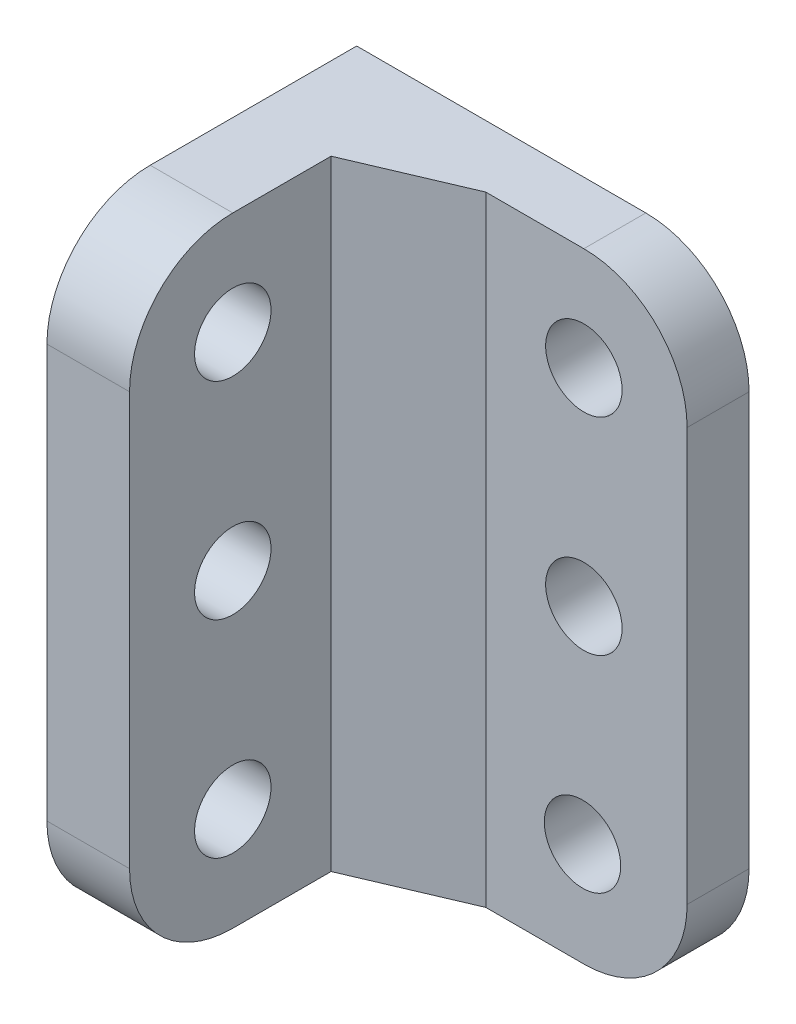
ISO-10303-21;
HEADER;
FILE_DESCRIPTION(('STEP AP214'),'2;1');
FILE_NAME('part.step','',(''),(''),'','','');
FILE_SCHEMA(('AUTOMOTIVE_DESIGN { 1 0 10303 214 1 1 1 1 }'));
ENDSEC;
DATA;
#1=APPLICATION_CONTEXT('core data for automotive mechanical design processes');
#2=APPLICATION_PROTOCOL_DEFINITION('international standard','automotive_design',2000,#1);
#3=PRODUCT_CONTEXT('',#1,'mechanical');
#4=PRODUCT('Part','Part','',(#3));
#5=PRODUCT_RELATED_PRODUCT_CATEGORY('part','',(#4));
#6=PRODUCT_DEFINITION_FORMATION('','',#4);
#7=PRODUCT_DEFINITION_CONTEXT('part definition',#1,'design');
#8=PRODUCT_DEFINITION('design','',#6,#7);
#9=PRODUCT_DEFINITION_SHAPE('','',#8);
#10=(LENGTH_UNIT() NAMED_UNIT(*) SI_UNIT(.MILLI.,.METRE.));
#11=(NAMED_UNIT(*) PLANE_ANGLE_UNIT() SI_UNIT($,.RADIAN.));
#12=(NAMED_UNIT(*) SI_UNIT($,.STERADIAN.) SOLID_ANGLE_UNIT());
#13=UNCERTAINTY_MEASURE_WITH_UNIT(LENGTH_MEASURE(1.E-05),#10,'distance_accuracy_value','');
#14=(GEOMETRIC_REPRESENTATION_CONTEXT(3) GLOBAL_UNCERTAINTY_ASSIGNED_CONTEXT((#13)) GLOBAL_UNIT_ASSIGNED_CONTEXT((#10,
#11,#12)) REPRESENTATION_CONTEXT('',''));
#15=CARTESIAN_POINT('',(0.,0.,0.));
#16=DIRECTION('',(0.,0.,1.));
#17=DIRECTION('',(1.,0.,0.));
#18=AXIS2_PLACEMENT_3D('',#15,#16,#17);
#19=CARTESIAN_POINT('',(0.,38.1,19.05));
#20=DIRECTION('',(1.,0.,0.));
#21=DIRECTION('',(0.,0.,-1.));
#22=AXIS2_PLACEMENT_3D('',#19,#20,#21);
#23=PLANE('',#22);
#24=CARTESIAN_POINT('',(0.,31.75,12.7));
#25=DIRECTION('',(1.,0.,0.));
#26=DIRECTION('',(0.,0.,-1.));
#27=AXIS2_PLACEMENT_3D('',#24,#25,#26);
#28=CIRCLE('',#27,2.3495);
#29=CARTESIAN_POINT('',(0.,31.75,10.3505));
#30=VERTEX_POINT('',#29);
#31=EDGE_CURVE('E296',#30,#30,#28,.T.);
#32=ORIENTED_EDGE('',*,*,#31,.T.);
#33=EDGE_LOOP('',(#32));
#34=FACE_BOUND('',#33,.T.);
#35=CARTESIAN_POINT('',(0.,19.05,12.7));
#36=DIRECTION('',(1.,0.,0.));
#37=DIRECTION('',(0.,0.,-1.));
#38=AXIS2_PLACEMENT_3D('',#35,#36,#37);
#39=CIRCLE('',#38,2.3495);
#40=CARTESIAN_POINT('',(0.,19.05,10.3505));
#41=VERTEX_POINT('',#40);
#42=EDGE_CURVE('E300',#41,#41,#39,.T.);
#43=ORIENTED_EDGE('',*,*,#42,.T.);
#44=EDGE_LOOP('',(#43));
#45=FACE_BOUND('',#44,.T.);
#46=CARTESIAN_POINT('',(0.,6.35000000000001,12.7));
#47=DIRECTION('',(1.,0.,0.));
#48=DIRECTION('',(0.,0.,-1.));
#49=AXIS2_PLACEMENT_3D('',#46,#47,#48);
#50=CIRCLE('',#49,2.3495);
#51=CARTESIAN_POINT('',(0.,6.35000000000001,10.3505));
#52=VERTEX_POINT('',#51);
#53=EDGE_CURVE('E310',#52,#52,#50,.T.);
#54=ORIENTED_EDGE('',*,*,#53,.T.);
#55=EDGE_LOOP('',(#54));
#56=FACE_BOUND('',#55,.T.);
#57=DIRECTION('',(0.,0.,1.));
#58=VECTOR('',#57,1.);
#59=CARTESIAN_POINT('',(0.,0.,19.05));
#60=LINE('',#59,#58);
#61=CARTESIAN_POINT('',(0.,0.,0.));
#62=VERTEX_POINT('',#61);
#63=CARTESIAN_POINT('',(0.,0.,12.7));
#64=VERTEX_POINT('',#63);
#65=EDGE_CURVE('E151',#62,#64,#60,.T.);
#66=ORIENTED_EDGE('',*,*,#65,.T.);
#67=CARTESIAN_POINT('',(0.,6.35,12.7));
#68=DIRECTION('',(1.,0.,0.));
#69=DIRECTION('',(0.,0.,-1.));
#70=AXIS2_PLACEMENT_3D('',#67,#68,#69);
#71=CIRCLE('',#70,6.35);
#72=CARTESIAN_POINT('',(0.,6.35000000000002,19.05));
#73=VERTEX_POINT('',#72);
#74=EDGE_CURVE('E11',#64,#73,#71,.F.);
#75=ORIENTED_EDGE('',*,*,#74,.T.);
#76=DIRECTION('',(0.,-1.,0.));
#77=VECTOR('',#76,1.);
#78=CARTESIAN_POINT('',(0.,38.1,19.05));
#79=LINE('',#78,#77);
#80=CARTESIAN_POINT('',(0.,31.75,19.05));
#81=VERTEX_POINT('',#80);
#82=EDGE_CURVE('E172',#81,#73,#79,.T.);
#83=ORIENTED_EDGE('',*,*,#82,.F.);
#84=CARTESIAN_POINT('',(0.,31.75,12.7));
#85=DIRECTION('',(1.,0.,0.));
#86=DIRECTION('',(0.,0.,-1.));
#87=AXIS2_PLACEMENT_3D('',#84,#85,#86);
#88=CIRCLE('',#87,6.35);
#89=CARTESIAN_POINT('',(0.,38.1,12.7));
#90=VERTEX_POINT('',#89);
#91=EDGE_CURVE('E41',#81,#90,#88,.F.);
#92=ORIENTED_EDGE('',*,*,#91,.T.);
#93=DIRECTION('',(0.,0.,1.));
#94=VECTOR('',#93,1.);
#95=CARTESIAN_POINT('',(0.,38.1,19.05));
#96=LINE('',#95,#94);
#97=CARTESIAN_POINT('',(0.,38.1,0.));
#98=VERTEX_POINT('',#97);
#99=EDGE_CURVE('E127',#98,#90,#96,.T.);
#100=ORIENTED_EDGE('',*,*,#99,.F.);
#101=DIRECTION('',(0.,-1.,0.));
#102=VECTOR('',#101,1.);
#103=CARTESIAN_POINT('',(0.,38.1,0.));
#104=LINE('',#103,#102);
#105=EDGE_CURVE('E150',#98,#62,#104,.T.);
#106=ORIENTED_EDGE('',*,*,#105,.T.);
#107=EDGE_LOOP('',(#66,#75,#83,#92,#100,#106));
#108=FACE_BOUND('',#107,.T.);
#109=ADVANCED_FACE('F33',(#34,#45,#56,#108),#23,.F.);
#110=CARTESIAN_POINT('',(5.08,38.1,19.05));
#111=DIRECTION('',(0.,0.,-1.));
#112=DIRECTION('',(-1.,0.,0.));
#113=AXIS2_PLACEMENT_3D('',#110,#111,#112);
#114=PLANE('',#113);
#115=ORIENTED_EDGE('',*,*,#82,.T.);
#116=DIRECTION('',(1.,0.,0.));
#117=VECTOR('',#116,1.);
#118=CARTESIAN_POINT('',(5.08,6.35,19.05));
#119=LINE('',#118,#117);
#120=CARTESIAN_POINT('',(5.08,6.35000000000002,19.05));
#121=VERTEX_POINT('',#120);
#122=EDGE_CURVE('E196',#73,#121,#119,.T.);
#123=ORIENTED_EDGE('',*,*,#122,.T.);
#124=DIRECTION('',(0.,-1.,0.));
#125=VECTOR('',#124,1.);
#126=CARTESIAN_POINT('',(5.08,38.1,19.05));
#127=LINE('',#126,#125);
#128=CARTESIAN_POINT('',(5.08,31.75,19.05));
#129=VERTEX_POINT('',#128);
#130=EDGE_CURVE('E137',#129,#121,#127,.T.);
#131=ORIENTED_EDGE('',*,*,#130,.F.);
#132=DIRECTION('',(1.,0.,0.));
#133=VECTOR('',#132,1.);
#134=CARTESIAN_POINT('',(5.08,31.75,19.05));
#135=LINE('',#134,#133);
#136=EDGE_CURVE('E53',#129,#81,#135,.F.);
#137=ORIENTED_EDGE('',*,*,#136,.T.);
#138=EDGE_LOOP('',(#115,#123,#131,#137));
#139=FACE_BOUND('',#138,.T.);
#140=ADVANCED_FACE('F207',(#139),#114,.F.);
#141=CARTESIAN_POINT('',(5.08,38.1,6.6548));
#142=DIRECTION('',(-1.,0.,0.));
#143=DIRECTION('',(0.,0.,1.));
#144=AXIS2_PLACEMENT_3D('',#141,#142,#143);
#145=PLANE('',#144);
#146=CARTESIAN_POINT('',(5.08,31.75,12.7));
#147=DIRECTION('',(1.,0.,0.));
#148=DIRECTION('',(0.,0.,-1.));
#149=AXIS2_PLACEMENT_3D('',#146,#147,#148);
#150=CIRCLE('',#149,2.3495);
#151=CARTESIAN_POINT('',(5.08,31.75,10.3505));
#152=VERTEX_POINT('',#151);
#153=EDGE_CURVE('E299',#152,#152,#150,.T.);
#154=ORIENTED_EDGE('',*,*,#153,.F.);
#155=EDGE_LOOP('',(#154));
#156=FACE_BOUND('',#155,.T.);
#157=CARTESIAN_POINT('',(5.08,19.05,12.7));
#158=DIRECTION('',(1.,0.,0.));
#159=DIRECTION('',(0.,0.,-1.));
#160=AXIS2_PLACEMENT_3D('',#157,#158,#159);
#161=CIRCLE('',#160,2.3495);
#162=CARTESIAN_POINT('',(5.08,19.05,10.3505));
#163=VERTEX_POINT('',#162);
#164=EDGE_CURVE('E305',#163,#163,#161,.T.);
#165=ORIENTED_EDGE('',*,*,#164,.F.);
#166=EDGE_LOOP('',(#165));
#167=FACE_BOUND('',#166,.T.);
#168=CARTESIAN_POINT('',(5.08,6.35000000000001,12.7));
#169=DIRECTION('',(1.,0.,0.));
#170=DIRECTION('',(0.,0.,-1.));
#171=AXIS2_PLACEMENT_3D('',#168,#169,#170);
#172=CIRCLE('',#171,2.3495);
#173=CARTESIAN_POINT('',(5.08,6.35000000000001,10.3505));
#174=VERTEX_POINT('',#173);
#175=EDGE_CURVE('E313',#174,#174,#172,.T.);
#176=ORIENTED_EDGE('',*,*,#175,.F.);
#177=EDGE_LOOP('',(#176));
#178=FACE_BOUND('',#177,.T.);
#179=ORIENTED_EDGE('',*,*,#130,.T.);
#180=CARTESIAN_POINT('',(5.08,6.35,12.7));
#181=DIRECTION('',(-1.,0.,0.));
#182=DIRECTION('',(0.,0.,1.));
#183=AXIS2_PLACEMENT_3D('',#180,#181,#182);
#184=CIRCLE('',#183,6.35);
#185=CARTESIAN_POINT('',(5.08,0.,12.7));
#186=VERTEX_POINT('',#185);
#187=EDGE_CURVE('E201',#121,#186,#184,.F.);
#188=ORIENTED_EDGE('',*,*,#187,.T.);
#189=DIRECTION('',(0.,0.,-1.));
#190=VECTOR('',#189,1.);
#191=CARTESIAN_POINT('',(5.08,0.,6.6548));
#192=LINE('',#191,#190);
#193=CARTESIAN_POINT('',(5.08,0.,6.6548));
#194=VERTEX_POINT('',#193);
#195=EDGE_CURVE('E134',#186,#194,#192,.T.);
#196=ORIENTED_EDGE('',*,*,#195,.T.);
#197=DIRECTION('',(0.,-1.,0.));
#198=VECTOR('',#197,1.);
#199=CARTESIAN_POINT('',(5.08,38.1,6.6548));
#200=LINE('',#199,#198);
#201=CARTESIAN_POINT('',(5.08,38.1,6.6548));
#202=VERTEX_POINT('',#201);
#203=EDGE_CURVE('E130',#202,#194,#200,.T.);
#204=ORIENTED_EDGE('',*,*,#203,.F.);
#205=DIRECTION('',(0.,0.,-1.));
#206=VECTOR('',#205,1.);
#207=CARTESIAN_POINT('',(5.08,38.1,6.6548));
#208=LINE('',#207,#206);
#209=CARTESIAN_POINT('',(5.08,38.1,12.7));
#210=VERTEX_POINT('',#209);
#211=EDGE_CURVE('E116',#210,#202,#208,.T.);
#212=ORIENTED_EDGE('',*,*,#211,.F.);
#213=CARTESIAN_POINT('',(5.08,31.75,12.7));
#214=DIRECTION('',(-1.,0.,0.));
#215=DIRECTION('',(0.,0.,1.));
#216=AXIS2_PLACEMENT_3D('',#213,#214,#215);
#217=CIRCLE('',#216,6.35);
#218=EDGE_CURVE('E199',#210,#129,#217,.F.);
#219=ORIENTED_EDGE('',*,*,#218,.T.);
#220=EDGE_LOOP('',(#179,#188,#196,#204,#212,#219));
#221=FACE_BOUND('',#220,.T.);
#222=ADVANCED_FACE('F132',(#156,#167,#178,#221),#145,.F.);
#223=CARTESIAN_POINT('',(11.7475,38.1,3.81));
#224=DIRECTION('',(-0.392438685047784,0.,-0.919778168080742));
#225=DIRECTION('',(-0.919778168080743,0.,0.392438685047784));
#226=AXIS2_PLACEMENT_3D('',#223,#224,#225);
#227=PLANE('',#226);
#228=DIRECTION('',(0.919778168080743,0.,-0.392438685047784));
#229=VECTOR('',#228,1.);
#230=CARTESIAN_POINT('',(11.7475,0.,3.81));
#231=LINE('',#230,#229);
#232=CARTESIAN_POINT('',(11.7475,0.,3.81));
#233=VERTEX_POINT('',#232);
#234=EDGE_CURVE('E155',#194,#233,#231,.T.);
#235=ORIENTED_EDGE('',*,*,#234,.T.);
#236=DIRECTION('',(0.,-1.,0.));
#237=VECTOR('',#236,1.);
#238=CARTESIAN_POINT('',(11.7475,38.1,3.81));
#239=LINE('',#238,#237);
#240=CARTESIAN_POINT('',(11.7475,38.1,3.81));
#241=VERTEX_POINT('',#240);
#242=EDGE_CURVE('E138',#241,#233,#239,.T.);
#243=ORIENTED_EDGE('',*,*,#242,.F.);
#244=DIRECTION('',(0.919778168080743,0.,-0.392438685047784));
#245=VECTOR('',#244,1.);
#246=CARTESIAN_POINT('',(11.7475,38.1,3.81));
#247=LINE('',#246,#245);
#248=EDGE_CURVE('E121',#202,#241,#247,.T.);
#249=ORIENTED_EDGE('',*,*,#248,.F.);
#250=ORIENTED_EDGE('',*,*,#203,.T.);
#251=EDGE_LOOP('',(#235,#243,#249,#250));
#252=FACE_BOUND('',#251,.T.);
#253=ADVANCED_FACE('F140',(#252),#227,.F.);
#254=CARTESIAN_POINT('',(24.13,38.1,3.81));
#255=DIRECTION('',(0.,0.,-1.));
#256=DIRECTION('',(-1.,0.,0.));
#257=AXIS2_PLACEMENT_3D('',#254,#255,#256);
#258=PLANE('',#257);
#259=CARTESIAN_POINT('',(17.6973232323232,6.35000000000001,3.81));
#260=DIRECTION('',(0.,0.,1.));
#261=DIRECTION('',(1.,0.,0.));
#262=AXIS2_PLACEMENT_3D('',#259,#260,#261);
#263=CIRCLE('',#262,2.3495);
#264=CARTESIAN_POINT('',(20.0468232323232,6.35000000000001,3.81));
#265=VERTEX_POINT('',#264);
#266=EDGE_CURVE('E318',#265,#265,#263,.T.);
#267=ORIENTED_EDGE('',*,*,#266,.F.);
#268=EDGE_LOOP('',(#267));
#269=FACE_BOUND('',#268,.T.);
#270=CARTESIAN_POINT('',(17.78,19.05,3.81));
#271=DIRECTION('',(0.,0.,1.));
#272=DIRECTION('',(1.,0.,0.));
#273=AXIS2_PLACEMENT_3D('',#270,#271,#272);
#274=CIRCLE('',#273,2.3495);
#275=CARTESIAN_POINT('',(20.1295,19.05,3.81));
#276=VERTEX_POINT('',#275);
#277=EDGE_CURVE('E324',#276,#276,#274,.T.);
#278=ORIENTED_EDGE('',*,*,#277,.F.);
#279=EDGE_LOOP('',(#278));
#280=FACE_BOUND('',#279,.T.);
#281=CARTESIAN_POINT('',(17.78,31.75,3.81));
#282=DIRECTION('',(0.,0.,1.));
#283=DIRECTION('',(1.,0.,0.));
#284=AXIS2_PLACEMENT_3D('',#281,#282,#283);
#285=CIRCLE('',#284,2.3495);
#286=CARTESIAN_POINT('',(20.1295,31.75,3.81));
#287=VERTEX_POINT('',#286);
#288=EDGE_CURVE('E302',#287,#287,#285,.T.);
#289=ORIENTED_EDGE('',*,*,#288,.F.);
#290=EDGE_LOOP('',(#289));
#291=FACE_BOUND('',#290,.T.);
#292=DIRECTION('',(0.,-1.,0.));
#293=VECTOR('',#292,1.);
#294=CARTESIAN_POINT('',(24.13,38.1,3.81));
#295=LINE('',#294,#293);
#296=CARTESIAN_POINT('',(24.13,31.75,3.81));
#297=VERTEX_POINT('',#296);
#298=CARTESIAN_POINT('',(24.13,6.35000000000002,3.81));
#299=VERTEX_POINT('',#298);
#300=EDGE_CURVE('E167',#297,#299,#295,.T.);
#301=ORIENTED_EDGE('',*,*,#300,.F.);
#302=CARTESIAN_POINT('',(17.78,31.75,3.81));
#303=DIRECTION('',(0.,0.,-1.));
#304=DIRECTION('',(-1.,0.,0.));
#305=AXIS2_PLACEMENT_3D('',#302,#303,#304);
#306=CIRCLE('',#305,6.35);
#307=CARTESIAN_POINT('',(17.78,38.1,3.81));
#308=VERTEX_POINT('',#307);
#309=EDGE_CURVE('E189',#297,#308,#306,.F.);
#310=ORIENTED_EDGE('',*,*,#309,.T.);
#311=DIRECTION('',(1.,0.,0.));
#312=VECTOR('',#311,1.);
#313=CARTESIAN_POINT('',(24.13,38.1,3.81));
#314=LINE('',#313,#312);
#315=EDGE_CURVE('E143',#241,#308,#314,.T.);
#316=ORIENTED_EDGE('',*,*,#315,.F.);
#317=ORIENTED_EDGE('',*,*,#242,.T.);
#318=DIRECTION('',(1.,0.,0.));
#319=VECTOR('',#318,1.);
#320=CARTESIAN_POINT('',(24.13,0.,3.81));
#321=LINE('',#320,#319);
#322=CARTESIAN_POINT('',(17.78,0.,3.81));
#323=VERTEX_POINT('',#322);
#324=EDGE_CURVE('E157',#233,#323,#321,.T.);
#325=ORIENTED_EDGE('',*,*,#324,.T.);
#326=CARTESIAN_POINT('',(17.78,6.35,3.81));
#327=DIRECTION('',(0.,0.,-1.));
#328=DIRECTION('',(-1.,0.,0.));
#329=AXIS2_PLACEMENT_3D('',#326,#327,#328);
#330=CIRCLE('',#329,6.35);
#331=EDGE_CURVE('E187',#323,#299,#330,.F.);
#332=ORIENTED_EDGE('',*,*,#331,.T.);
#333=EDGE_LOOP('',(#301,#310,#316,#317,#325,#332));
#334=FACE_BOUND('',#333,.T.);
#335=ADVANCED_FACE('F219',(#269,#280,#291,#334),#258,.F.);
#336=CARTESIAN_POINT('',(24.13,38.1,0.));
#337=DIRECTION('',(-1.,0.,0.));
#338=DIRECTION('',(0.,0.,1.));
#339=AXIS2_PLACEMENT_3D('',#336,#337,#338);
#340=PLANE('',#339);
#341=DIRECTION('',(0.,-1.,0.));
#342=VECTOR('',#341,1.);
#343=CARTESIAN_POINT('',(24.13,38.1,0.));
#344=LINE('',#343,#342);
#345=CARTESIAN_POINT('',(24.13,31.75,0.));
#346=VERTEX_POINT('',#345);
#347=CARTESIAN_POINT('',(24.13,6.35000000000002,0.));
#348=VERTEX_POINT('',#347);
#349=EDGE_CURVE('E164',#346,#348,#344,.T.);
#350=ORIENTED_EDGE('',*,*,#349,.F.);
#351=DIRECTION('',(0.,0.,-1.));
#352=VECTOR('',#351,1.);
#353=CARTESIAN_POINT('',(24.13,31.75,0.));
#354=LINE('',#353,#352);
#355=EDGE_CURVE('E185',#346,#297,#354,.F.);
#356=ORIENTED_EDGE('',*,*,#355,.T.);
#357=ORIENTED_EDGE('',*,*,#300,.T.);
#358=DIRECTION('',(0.,0.,-1.));
#359=VECTOR('',#358,1.);
#360=CARTESIAN_POINT('',(24.13,6.35,0.));
#361=LINE('',#360,#359);
#362=EDGE_CURVE('E182',#299,#348,#361,.T.);
#363=ORIENTED_EDGE('',*,*,#362,.T.);
#364=EDGE_LOOP('',(#350,#356,#357,#363));
#365=FACE_BOUND('',#364,.T.);
#366=ADVANCED_FACE('F230',(#365),#340,.F.);
#367=CARTESIAN_POINT('',(0.,38.1,0.));
#368=DIRECTION('',(0.,0.,1.));
#369=DIRECTION('',(1.,0.,0.));
#370=AXIS2_PLACEMENT_3D('',#367,#368,#369);
#371=PLANE('',#370);
#372=CARTESIAN_POINT('',(17.6973232323232,6.35000000000001,0.));
#373=DIRECTION('',(0.,0.,1.));
#374=DIRECTION('',(1.,0.,0.));
#375=AXIS2_PLACEMENT_3D('',#372,#373,#374);
#376=CIRCLE('',#375,2.3495);
#377=CARTESIAN_POINT('',(20.0468232323232,6.35000000000001,0.));
#378=VERTEX_POINT('',#377);
#379=EDGE_CURVE('E153',#378,#378,#376,.T.);
#380=ORIENTED_EDGE('',*,*,#379,.T.);
#381=EDGE_LOOP('',(#380));
#382=FACE_BOUND('',#381,.T.);
#383=CARTESIAN_POINT('',(17.78,19.05,0.));
#384=DIRECTION('',(0.,0.,1.));
#385=DIRECTION('',(1.,0.,0.));
#386=AXIS2_PLACEMENT_3D('',#383,#384,#385);
#387=CIRCLE('',#386,2.3495);
#388=CARTESIAN_POINT('',(20.1295,19.05,0.));
#389=VERTEX_POINT('',#388);
#390=EDGE_CURVE('E321',#389,#389,#387,.T.);
#391=ORIENTED_EDGE('',*,*,#390,.T.);
#392=EDGE_LOOP('',(#391));
#393=FACE_BOUND('',#392,.T.);
#394=CARTESIAN_POINT('',(17.78,31.75,0.));
#395=DIRECTION('',(0.,0.,1.));
#396=DIRECTION('',(1.,0.,0.));
#397=AXIS2_PLACEMENT_3D('',#394,#395,#396);
#398=CIRCLE('',#397,2.3495);
#399=CARTESIAN_POINT('',(20.1295,31.75,0.));
#400=VERTEX_POINT('',#399);
#401=EDGE_CURVE('E327',#400,#400,#398,.T.);
#402=ORIENTED_EDGE('',*,*,#401,.T.);
#403=EDGE_LOOP('',(#402));
#404=FACE_BOUND('',#403,.T.);
#405=DIRECTION('',(-1.,0.,0.));
#406=VECTOR('',#405,1.);
#407=CARTESIAN_POINT('',(0.,38.1,0.));
#408=LINE('',#407,#406);
#409=CARTESIAN_POINT('',(17.78,38.1,0.));
#410=VERTEX_POINT('',#409);
#411=EDGE_CURVE('E145',#410,#98,#408,.T.);
#412=ORIENTED_EDGE('',*,*,#411,.F.);
#413=CARTESIAN_POINT('',(17.78,31.75,0.));
#414=DIRECTION('',(0.,0.,1.));
#415=DIRECTION('',(1.,0.,0.));
#416=AXIS2_PLACEMENT_3D('',#413,#414,#415);
#417=CIRCLE('',#416,6.35);
#418=EDGE_CURVE('E180',#410,#346,#417,.F.);
#419=ORIENTED_EDGE('',*,*,#418,.T.);
#420=ORIENTED_EDGE('',*,*,#349,.T.);
#421=CARTESIAN_POINT('',(17.78,6.35,0.));
#422=DIRECTION('',(0.,0.,1.));
#423=DIRECTION('',(1.,0.,0.));
#424=AXIS2_PLACEMENT_3D('',#421,#422,#423);
#425=CIRCLE('',#424,6.35);
#426=CARTESIAN_POINT('',(17.78,0.,0.));
#427=VERTEX_POINT('',#426);
#428=EDGE_CURVE('E178',#348,#427,#425,.F.);
#429=ORIENTED_EDGE('',*,*,#428,.T.);
#430=DIRECTION('',(-1.,0.,0.));
#431=VECTOR('',#430,1.);
#432=CARTESIAN_POINT('',(0.,0.,0.));
#433=LINE('',#432,#431);
#434=EDGE_CURVE('E160',#427,#62,#433,.T.);
#435=ORIENTED_EDGE('',*,*,#434,.T.);
#436=ORIENTED_EDGE('',*,*,#105,.F.);
#437=EDGE_LOOP('',(#412,#419,#420,#429,#435,#436));
#438=FACE_BOUND('',#437,.T.);
#439=ADVANCED_FACE('F228',(#382,#393,#404,#438),#371,.F.);
#440=CARTESIAN_POINT('',(0.,38.1,0.));
#441=DIRECTION('',(0.,-1.,0.));
#442=DIRECTION('',(0.,0.,-1.));
#443=AXIS2_PLACEMENT_3D('',#440,#441,#442);
#444=PLANE('',#443);
#445=ORIENTED_EDGE('',*,*,#315,.T.);
#446=DIRECTION('',(0.,0.,-1.));
#447=VECTOR('',#446,1.);
#448=CARTESIAN_POINT('',(17.78,38.1,0.));
#449=LINE('',#448,#447);
#450=EDGE_CURVE('E175',#308,#410,#449,.T.);
#451=ORIENTED_EDGE('',*,*,#450,.T.);
#452=ORIENTED_EDGE('',*,*,#411,.T.);
#453=ORIENTED_EDGE('',*,*,#99,.T.);
#454=DIRECTION('',(1.,0.,0.));
#455=VECTOR('',#454,1.);
#456=CARTESIAN_POINT('',(0.,38.1,12.7));
#457=LINE('',#456,#455);
#458=EDGE_CURVE('E125',#90,#210,#457,.T.);
#459=ORIENTED_EDGE('',*,*,#458,.T.);
#460=ORIENTED_EDGE('',*,*,#211,.T.);
#461=ORIENTED_EDGE('',*,*,#248,.T.);
#462=EDGE_LOOP('',(#445,#451,#452,#453,#459,#460,#461));
#463=FACE_BOUND('',#462,.T.);
#464=ADVANCED_FACE('F119',(#463),#444,.F.);
#465=CARTESIAN_POINT('',(0.,0.,0.));
#466=DIRECTION('',(0.,-1.,0.));
#467=DIRECTION('',(0.,0.,-1.));
#468=AXIS2_PLACEMENT_3D('',#465,#466,#467);
#469=PLANE('',#468);
#470=ORIENTED_EDGE('',*,*,#434,.F.);
#471=DIRECTION('',(0.,0.,-1.));
#472=VECTOR('',#471,1.);
#473=CARTESIAN_POINT('',(17.78,0.,3.81));
#474=LINE('',#473,#472);
#475=EDGE_CURVE('E193',#427,#323,#474,.F.);
#476=ORIENTED_EDGE('',*,*,#475,.T.);
#477=ORIENTED_EDGE('',*,*,#324,.F.);
#478=ORIENTED_EDGE('',*,*,#234,.F.);
#479=ORIENTED_EDGE('',*,*,#195,.F.);
#480=DIRECTION('',(1.,0.,0.));
#481=VECTOR('',#480,1.);
#482=CARTESIAN_POINT('',(0.,0.,12.7));
#483=LINE('',#482,#481);
#484=EDGE_CURVE('E191',#186,#64,#483,.F.);
#485=ORIENTED_EDGE('',*,*,#484,.T.);
#486=ORIENTED_EDGE('',*,*,#65,.F.);
#487=EDGE_LOOP('',(#470,#476,#477,#478,#479,#485,#486));
#488=FACE_BOUND('',#487,.T.);
#489=ADVANCED_FACE('F214',(#488),#469,.T.);
#490=CARTESIAN_POINT('',(17.78,31.75,0.));
#491=DIRECTION('',(0.,0.,1.));
#492=DIRECTION('',(1.,0.,0.));
#493=AXIS2_PLACEMENT_3D('',#490,#491,#492);
#494=CYLINDRICAL_SURFACE('',#493,2.3495);
#495=ORIENTED_EDGE('',*,*,#401,.F.);
#496=EDGE_LOOP('',(#495));
#497=FACE_BOUND('',#496,.T.);
#498=ORIENTED_EDGE('',*,*,#288,.T.);
#499=EDGE_LOOP('',(#498));
#500=FACE_BOUND('',#499,.T.);
#501=ADVANCED_FACE('F268',(#497,#500),#494,.F.);
#502=CARTESIAN_POINT('',(17.78,19.05,0.));
#503=DIRECTION('',(0.,0.,1.));
#504=DIRECTION('',(1.,0.,0.));
#505=AXIS2_PLACEMENT_3D('',#502,#503,#504);
#506=CYLINDRICAL_SURFACE('',#505,2.3495);
#507=ORIENTED_EDGE('',*,*,#390,.F.);
#508=EDGE_LOOP('',(#507));
#509=FACE_BOUND('',#508,.T.);
#510=ORIENTED_EDGE('',*,*,#277,.T.);
#511=EDGE_LOOP('',(#510));
#512=FACE_BOUND('',#511,.T.);
#513=ADVANCED_FACE('F273',(#509,#512),#506,.F.);
#514=CARTESIAN_POINT('',(17.6973232323232,6.35000000000001,0.));
#515=DIRECTION('',(0.,0.,1.));
#516=DIRECTION('',(1.,0.,0.));
#517=AXIS2_PLACEMENT_3D('',#514,#515,#516);
#518=CYLINDRICAL_SURFACE('',#517,2.3495);
#519=ORIENTED_EDGE('',*,*,#379,.F.);
#520=EDGE_LOOP('',(#519));
#521=FACE_BOUND('',#520,.T.);
#522=ORIENTED_EDGE('',*,*,#266,.T.);
#523=EDGE_LOOP('',(#522));
#524=FACE_BOUND('',#523,.T.);
#525=ADVANCED_FACE('F277',(#521,#524),#518,.F.);
#526=CARTESIAN_POINT('',(0.,6.35000000000001,12.7));
#527=DIRECTION('',(1.,0.,0.));
#528=DIRECTION('',(0.,0.,-1.));
#529=AXIS2_PLACEMENT_3D('',#526,#527,#528);
#530=CYLINDRICAL_SURFACE('',#529,2.3495);
#531=ORIENTED_EDGE('',*,*,#53,.F.);
#532=EDGE_LOOP('',(#531));
#533=FACE_BOUND('',#532,.T.);
#534=ORIENTED_EDGE('',*,*,#175,.T.);
#535=EDGE_LOOP('',(#534));
#536=FACE_BOUND('',#535,.T.);
#537=ADVANCED_FACE('F281',(#533,#536),#530,.F.);
#538=CARTESIAN_POINT('',(0.,19.05,12.7));
#539=DIRECTION('',(1.,0.,0.));
#540=DIRECTION('',(0.,0.,-1.));
#541=AXIS2_PLACEMENT_3D('',#538,#539,#540);
#542=CYLINDRICAL_SURFACE('',#541,2.3495);
#543=ORIENTED_EDGE('',*,*,#42,.F.);
#544=EDGE_LOOP('',(#543));
#545=FACE_BOUND('',#544,.T.);
#546=ORIENTED_EDGE('',*,*,#164,.T.);
#547=EDGE_LOOP('',(#546));
#548=FACE_BOUND('',#547,.T.);
#549=ADVANCED_FACE('F285',(#545,#548),#542,.F.);
#550=CARTESIAN_POINT('',(0.,31.75,12.7));
#551=DIRECTION('',(1.,0.,0.));
#552=DIRECTION('',(0.,0.,-1.));
#553=AXIS2_PLACEMENT_3D('',#550,#551,#552);
#554=CYLINDRICAL_SURFACE('',#553,2.3495);
#555=ORIENTED_EDGE('',*,*,#31,.F.);
#556=EDGE_LOOP('',(#555));
#557=FACE_BOUND('',#556,.T.);
#558=ORIENTED_EDGE('',*,*,#153,.T.);
#559=EDGE_LOOP('',(#558));
#560=FACE_BOUND('',#559,.T.);
#561=ADVANCED_FACE('F241',(#557,#560),#554,.F.);
#562=CARTESIAN_POINT('',(17.78,31.75,0.));
#563=DIRECTION('',(0.,0.,-1.));
#564=DIRECTION('',(-1.,0.,0.));
#565=AXIS2_PLACEMENT_3D('',#562,#563,#564);
#566=CYLINDRICAL_SURFACE('',#565,6.35);
#567=ORIENTED_EDGE('',*,*,#309,.F.);
#568=ORIENTED_EDGE('',*,*,#355,.F.);
#569=ORIENTED_EDGE('',*,*,#418,.F.);
#570=ORIENTED_EDGE('',*,*,#450,.F.);
#571=EDGE_LOOP('',(#567,#568,#569,#570));
#572=FACE_BOUND('',#571,.T.);
#573=ADVANCED_FACE('F224',(#572),#566,.T.);
#574=CARTESIAN_POINT('',(17.78,6.35,0.));
#575=DIRECTION('',(0.,0.,1.));
#576=DIRECTION('',(1.,0.,0.));
#577=AXIS2_PLACEMENT_3D('',#574,#575,#576);
#578=CYLINDRICAL_SURFACE('',#577,6.35);
#579=ORIENTED_EDGE('',*,*,#331,.F.);
#580=ORIENTED_EDGE('',*,*,#475,.F.);
#581=ORIENTED_EDGE('',*,*,#428,.F.);
#582=ORIENTED_EDGE('',*,*,#362,.F.);
#583=EDGE_LOOP('',(#579,#580,#581,#582));
#584=FACE_BOUND('',#583,.T.);
#585=ADVANCED_FACE('F233',(#584),#578,.T.);
#586=CARTESIAN_POINT('',(5.08,6.35,12.7));
#587=DIRECTION('',(-1.,0.,0.));
#588=DIRECTION('',(0.,0.,1.));
#589=AXIS2_PLACEMENT_3D('',#586,#587,#588);
#590=CYLINDRICAL_SURFACE('',#589,6.35);
#591=ORIENTED_EDGE('',*,*,#74,.F.);
#592=ORIENTED_EDGE('',*,*,#484,.F.);
#593=ORIENTED_EDGE('',*,*,#187,.F.);
#594=ORIENTED_EDGE('',*,*,#122,.F.);
#595=EDGE_LOOP('',(#591,#592,#593,#594));
#596=FACE_BOUND('',#595,.T.);
#597=ADVANCED_FACE('F210',(#596),#590,.T.);
#598=CARTESIAN_POINT('',(0.,31.75,12.7));
#599=DIRECTION('',(1.,0.,0.));
#600=DIRECTION('',(0.,0.,-1.));
#601=AXIS2_PLACEMENT_3D('',#598,#599,#600);
#602=CYLINDRICAL_SURFACE('',#601,6.35);
#603=ORIENTED_EDGE('',*,*,#91,.F.);
#604=ORIENTED_EDGE('',*,*,#136,.F.);
#605=ORIENTED_EDGE('',*,*,#218,.F.);
#606=ORIENTED_EDGE('',*,*,#458,.F.);
#607=EDGE_LOOP('',(#603,#604,#605,#606));
#608=FACE_BOUND('',#607,.T.);
#609=ADVANCED_FACE('F35',(#608),#602,.T.);
#610=CLOSED_SHELL('',(#109,#140,#222,#253,#335,#366,#439,#464,#489,#501,#513,#525,#537,#549,
#561,#573,#585,#597,#609));
#611=MANIFOLD_SOLID_BREP('B2',#610);
#612=ADVANCED_BREP_SHAPE_REPRESENTATION('',(#18,#611),#14);
#613=SHAPE_DEFINITION_REPRESENTATION(#9,#612);
ENDSEC;
END-ISO-10303-21;
